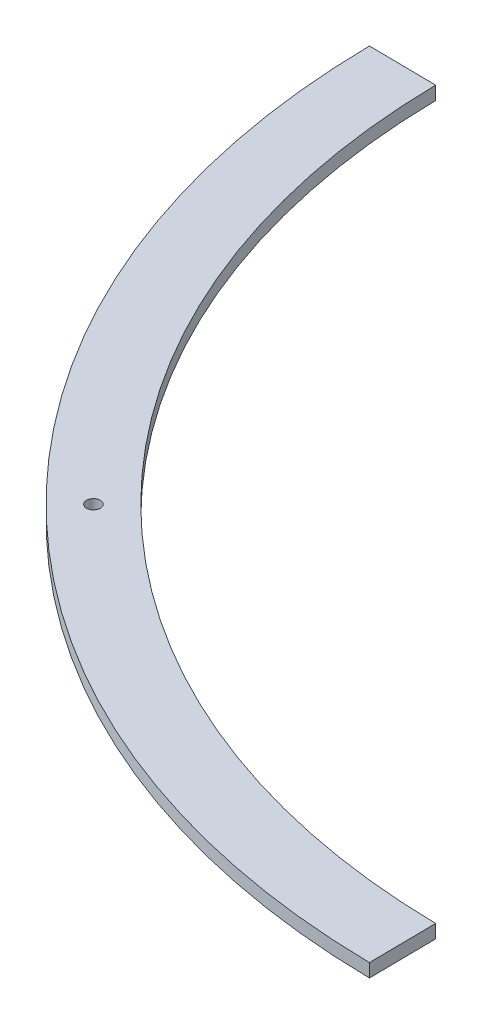
ISO-10303-21;
HEADER;
FILE_DESCRIPTION(('STEP AP214'),'2;1');
FILE_NAME('part.step','',(''),(''),'','','');
FILE_SCHEMA(('AUTOMOTIVE_DESIGN { 1 0 10303 214 1 1 1 1 }'));
ENDSEC;
DATA;
#1=APPLICATION_CONTEXT('core data for automotive mechanical design processes');
#2=APPLICATION_PROTOCOL_DEFINITION('international standard','automotive_design',2000,#1);
#3=PRODUCT_CONTEXT('',#1,'mechanical');
#4=PRODUCT('Part','Part','',(#3));
#5=PRODUCT_RELATED_PRODUCT_CATEGORY('part','',(#4));
#6=PRODUCT_DEFINITION_FORMATION('','',#4);
#7=PRODUCT_DEFINITION_CONTEXT('part definition',#1,'design');
#8=PRODUCT_DEFINITION('design','',#6,#7);
#9=PRODUCT_DEFINITION_SHAPE('','',#8);
#10=(LENGTH_UNIT() NAMED_UNIT(*) SI_UNIT(.MILLI.,.METRE.));
#11=(NAMED_UNIT(*) PLANE_ANGLE_UNIT() SI_UNIT($,.RADIAN.));
#12=(NAMED_UNIT(*) SI_UNIT($,.STERADIAN.) SOLID_ANGLE_UNIT());
#13=UNCERTAINTY_MEASURE_WITH_UNIT(LENGTH_MEASURE(1.E-05),#10,'distance_accuracy_value','');
#14=(GEOMETRIC_REPRESENTATION_CONTEXT(3) GLOBAL_UNCERTAINTY_ASSIGNED_CONTEXT((#13)) GLOBAL_UNIT_ASSIGNED_CONTEXT((#10,
#11,#12)) REPRESENTATION_CONTEXT('',''));
#15=CARTESIAN_POINT('',(0.,0.,0.));
#16=DIRECTION('',(0.,0.,1.));
#17=DIRECTION('',(1.,0.,0.));
#18=AXIS2_PLACEMENT_3D('',#15,#16,#17);
#19=CARTESIAN_POINT('',(90.,3.,-90.));
#20=DIRECTION('',(0.,1.,0.));
#21=DIRECTION('',(0.,0.,1.));
#22=AXIS2_PLACEMENT_3D('',#19,#20,#21);
#23=PLANE('',#22);
#24=CARTESIAN_POINT('',(90.,3.,-90.));
#25=DIRECTION('',(0.,1.,0.));
#26=DIRECTION('',(0.,0.,1.));
#27=AXIS2_PLACEMENT_3D('',#24,#25,#26);
#28=CIRCLE('',#27,180.011984766246);
#29=CARTESIAN_POINT('',(-90.,3.,-87.9228241569348));
#30=VERTEX_POINT('',#29);
#31=CARTESIAN_POINT('',(87.9228241569358,3.,90.));
#32=VERTEX_POINT('',#31);
#33=EDGE_CURVE('E92',#30,#32,#28,.T.);
#34=ORIENTED_EDGE('',*,*,#33,.T.);
#35=DIRECTION('',(-0.011620433145782,0.,-0.99993248048731));
#36=VECTOR('',#35,1.);
#37=CARTESIAN_POINT('',(87.9228241569358,3.,90.));
#38=LINE('',#37,#36);
#39=CARTESIAN_POINT('',(87.748327336338,3.,74.9846355580292));
#40=VERTEX_POINT('',#39);
#41=EDGE_CURVE('E87',#32,#40,#38,.T.);
#42=ORIENTED_EDGE('',*,*,#41,.T.);
#43=CARTESIAN_POINT('',(90.,3.,-90.));
#44=DIRECTION('',(0.,-1.,0.));
#45=DIRECTION('',(0.,0.,1.));
#46=AXIS2_PLACEMENT_3D('',#43,#44,#45);
#47=CIRCLE('',#46,165.);
#48=CARTESIAN_POINT('',(-74.9846583776807,3.,-87.75));
#49=VERTEX_POINT('',#48);
#50=EDGE_CURVE('E90',#40,#49,#47,.T.);
#51=ORIENTED_EDGE('',*,*,#50,.T.);
#52=DIRECTION('',(-0.999933768389495,0.,-0.011509076174179));
#53=VECTOR('',#52,1.);
#54=CARTESIAN_POINT('',(-90.,3.,-87.9228241569348));
#55=LINE('',#54,#53);
#56=EDGE_CURVE('E57',#49,#30,#55,.T.);
#57=ORIENTED_EDGE('',*,*,#56,.T.);
#58=EDGE_LOOP('',(#34,#42,#51,#57));
#59=FACE_BOUND('',#58,.T.);
#60=CARTESIAN_POINT('',(-31.9759197546794,3.,31.9759197546794));
#61=DIRECTION('',(0.,1.,0.));
#62=DIRECTION('',(0.,0.,1.));
#63=AXIS2_PLACEMENT_3D('',#60,#61,#62);
#64=CIRCLE('',#63,1.55);
#65=CARTESIAN_POINT('',(-31.9759197546794,3.,33.5259197546794));
#66=VERTEX_POINT('',#65);
#67=EDGE_CURVE('E112',#66,#66,#64,.T.);
#68=ORIENTED_EDGE('',*,*,#67,.F.);
#69=EDGE_LOOP('',(#68));
#70=FACE_BOUND('',#69,.T.);
#71=ADVANCED_FACE('F39',(#59,#70),#23,.T.);
#72=CARTESIAN_POINT('',(90.,0.,-90.));
#73=DIRECTION('',(0.,1.,0.));
#74=DIRECTION('',(0.,0.,1.));
#75=AXIS2_PLACEMENT_3D('',#72,#73,#74);
#76=PLANE('',#75);
#77=CARTESIAN_POINT('',(90.,0.,-90.));
#78=DIRECTION('',(0.,1.,0.));
#79=DIRECTION('',(0.,0.,1.));
#80=AXIS2_PLACEMENT_3D('',#77,#78,#79);
#81=CIRCLE('',#80,180.011984766246);
#82=CARTESIAN_POINT('',(-90.,0.,-87.9228241569348));
#83=VERTEX_POINT('',#82);
#84=CARTESIAN_POINT('',(87.9228241569358,0.,90.));
#85=VERTEX_POINT('',#84);
#86=EDGE_CURVE('E108',#83,#85,#81,.T.);
#87=ORIENTED_EDGE('',*,*,#86,.F.);
#88=DIRECTION('',(-0.999933768389495,0.,-0.011509076174179));
#89=VECTOR('',#88,1.);
#90=CARTESIAN_POINT('',(-90.,0.,-87.9228241569348));
#91=LINE('',#90,#89);
#92=CARTESIAN_POINT('',(-74.9846583776807,0.,-87.75));
#93=VERTEX_POINT('',#92);
#94=EDGE_CURVE('E80',#93,#83,#91,.T.);
#95=ORIENTED_EDGE('',*,*,#94,.F.);
#96=CARTESIAN_POINT('',(90.,0.,-90.));
#97=DIRECTION('',(0.,-1.,0.));
#98=DIRECTION('',(0.,0.,1.));
#99=AXIS2_PLACEMENT_3D('',#96,#97,#98);
#100=CIRCLE('',#99,165.);
#101=CARTESIAN_POINT('',(87.748327336338,0.,74.9846355580292));
#102=VERTEX_POINT('',#101);
#103=EDGE_CURVE('E74',#102,#93,#100,.T.);
#104=ORIENTED_EDGE('',*,*,#103,.F.);
#105=DIRECTION('',(-0.011620433145782,0.,-0.99993248048731));
#106=VECTOR('',#105,1.);
#107=CARTESIAN_POINT('',(87.9228241569358,0.,90.));
#108=LINE('',#107,#106);
#109=EDGE_CURVE('E97',#85,#102,#108,.T.);
#110=ORIENTED_EDGE('',*,*,#109,.F.);
#111=EDGE_LOOP('',(#87,#95,#104,#110));
#112=FACE_BOUND('',#111,.T.);
#113=CARTESIAN_POINT('',(-31.9759197546794,0.,31.9759197546794));
#114=DIRECTION('',(0.,1.,0.));
#115=DIRECTION('',(0.,0.,1.));
#116=AXIS2_PLACEMENT_3D('',#113,#114,#115);
#117=CIRCLE('',#116,1.55);
#118=CARTESIAN_POINT('',(-31.9759197546794,0.,33.5259197546794));
#119=VERTEX_POINT('',#118);
#120=EDGE_CURVE('E130',#119,#119,#117,.T.);
#121=ORIENTED_EDGE('',*,*,#120,.T.);
#122=EDGE_LOOP('',(#121));
#123=FACE_BOUND('',#122,.T.);
#124=ADVANCED_FACE('F125',(#112,#123),#76,.F.);
#125=CARTESIAN_POINT('',(90.,3.,-90.));
#126=DIRECTION('',(0.,-1.,0.));
#127=DIRECTION('',(0.,0.,-1.));
#128=AXIS2_PLACEMENT_3D('',#125,#126,#127);
#129=CYLINDRICAL_SURFACE('',#128,180.011984766246);
#130=ORIENTED_EDGE('',*,*,#86,.T.);
#131=DIRECTION('',(0.,-1.,0.));
#132=VECTOR('',#131,1.);
#133=CARTESIAN_POINT('',(87.9228241569358,3.,90.));
#134=LINE('',#133,#132);
#135=EDGE_CURVE('E11',#32,#85,#134,.T.);
#136=ORIENTED_EDGE('',*,*,#135,.F.);
#137=ORIENTED_EDGE('',*,*,#33,.F.);
#138=DIRECTION('',(0.,-1.,0.));
#139=VECTOR('',#138,1.);
#140=CARTESIAN_POINT('',(-90.,3.,-87.9228241569348));
#141=LINE('',#140,#139);
#142=EDGE_CURVE('E104',#30,#83,#141,.T.);
#143=ORIENTED_EDGE('',*,*,#142,.T.);
#144=EDGE_LOOP('',(#130,#136,#137,#143));
#145=FACE_BOUND('',#144,.T.);
#146=ADVANCED_FACE('F41',(#145),#129,.T.);
#147=CARTESIAN_POINT('',(87.9228241569358,3.,90.));
#148=DIRECTION('',(-0.99993248048731,0.,0.011620433145782));
#149=DIRECTION('',(0.011620433145782,0.,0.99993248048731));
#150=AXIS2_PLACEMENT_3D('',#147,#148,#149);
#151=PLANE('',#150);
#152=ORIENTED_EDGE('',*,*,#109,.T.);
#153=DIRECTION('',(0.,-1.,0.));
#154=VECTOR('',#153,1.);
#155=CARTESIAN_POINT('',(87.748327336338,3.,74.9846355580292));
#156=LINE('',#155,#154);
#157=EDGE_CURVE('E49',#40,#102,#156,.T.);
#158=ORIENTED_EDGE('',*,*,#157,.F.);
#159=ORIENTED_EDGE('',*,*,#41,.F.);
#160=ORIENTED_EDGE('',*,*,#135,.T.);
#161=EDGE_LOOP('',(#152,#158,#159,#160));
#162=FACE_BOUND('',#161,.T.);
#163=ADVANCED_FACE('F96',(#162),#151,.F.);
#164=CARTESIAN_POINT('',(90.,3.,-90.));
#165=DIRECTION('',(0.,-1.,0.));
#166=DIRECTION('',(0.,0.,-1.));
#167=AXIS2_PLACEMENT_3D('',#164,#165,#166);
#168=CYLINDRICAL_SURFACE('',#167,165.);
#169=ORIENTED_EDGE('',*,*,#103,.T.);
#170=DIRECTION('',(0.,-1.,0.));
#171=VECTOR('',#170,1.);
#172=CARTESIAN_POINT('',(-74.9846583776807,3.,-87.75));
#173=LINE('',#172,#171);
#174=EDGE_CURVE('E99',#49,#93,#173,.T.);
#175=ORIENTED_EDGE('',*,*,#174,.F.);
#176=ORIENTED_EDGE('',*,*,#50,.F.);
#177=ORIENTED_EDGE('',*,*,#157,.T.);
#178=EDGE_LOOP('',(#169,#175,#176,#177));
#179=FACE_BOUND('',#178,.T.);
#180=ADVANCED_FACE('F100',(#179),#168,.F.);
#181=CARTESIAN_POINT('',(-90.,3.,-87.9228241569348));
#182=DIRECTION('',(-0.011509076174179,0.,0.999933768389495));
#183=DIRECTION('',(0.999933768389495,0.,0.011509076174179));
#184=AXIS2_PLACEMENT_3D('',#181,#182,#183);
#185=PLANE('',#184);
#186=ORIENTED_EDGE('',*,*,#94,.T.);
#187=ORIENTED_EDGE('',*,*,#142,.F.);
#188=ORIENTED_EDGE('',*,*,#56,.F.);
#189=ORIENTED_EDGE('',*,*,#174,.T.);
#190=EDGE_LOOP('',(#186,#187,#188,#189));
#191=FACE_BOUND('',#190,.T.);
#192=ADVANCED_FACE('F122',(#191),#185,.F.);
#193=CARTESIAN_POINT('',(-31.9759197546794,3.,31.9759197546794));
#194=DIRECTION('',(0.,-1.,0.));
#195=DIRECTION('',(0.,0.,-1.));
#196=AXIS2_PLACEMENT_3D('',#193,#194,#195);
#197=CYLINDRICAL_SURFACE('',#196,1.55);
#198=ORIENTED_EDGE('',*,*,#67,.T.);
#199=EDGE_LOOP('',(#198));
#200=FACE_BOUND('',#199,.T.);
#201=ORIENTED_EDGE('',*,*,#120,.F.);
#202=EDGE_LOOP('',(#201));
#203=FACE_BOUND('',#202,.T.);
#204=ADVANCED_FACE('F138',(#200,#203),#197,.F.);
#205=CLOSED_SHELL('',(#71,#124,#146,#163,#180,#192,#204));
#206=MANIFOLD_SOLID_BREP('B2',#205);
#207=ADVANCED_BREP_SHAPE_REPRESENTATION('',(#18,#206),#14);
#208=SHAPE_DEFINITION_REPRESENTATION(#9,#207);
ENDSEC;
END-ISO-10303-21;
